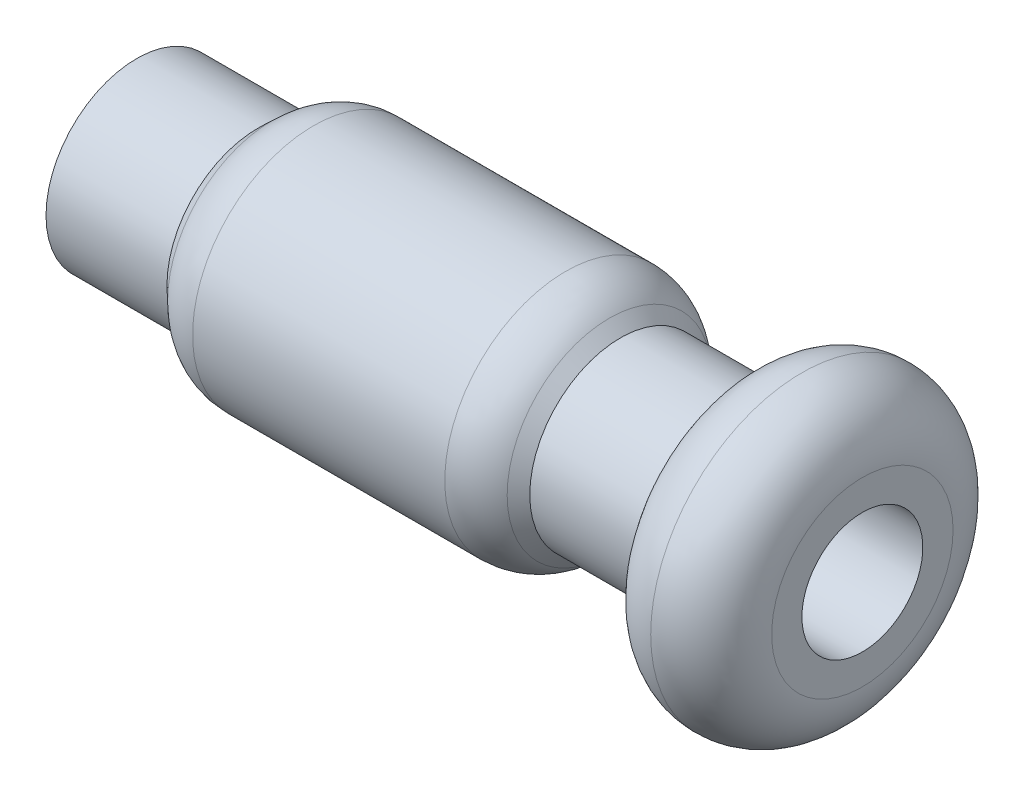
ISO-10303-21;
HEADER;
FILE_DESCRIPTION(('STEP AP214'),'2;1');
FILE_NAME('part.step','',(''),(''),'','','');
FILE_SCHEMA(('AUTOMOTIVE_DESIGN { 1 0 10303 214 1 1 1 1 }'));
ENDSEC;
DATA;
#1=APPLICATION_CONTEXT('core data for automotive mechanical design processes');
#2=APPLICATION_PROTOCOL_DEFINITION('international standard','automotive_design',2000,#1);
#3=PRODUCT_CONTEXT('',#1,'mechanical');
#4=PRODUCT('Part','Part','',(#3));
#5=PRODUCT_RELATED_PRODUCT_CATEGORY('part','',(#4));
#6=PRODUCT_DEFINITION_FORMATION('','',#4);
#7=PRODUCT_DEFINITION_CONTEXT('part definition',#1,'design');
#8=PRODUCT_DEFINITION('design','',#6,#7);
#9=PRODUCT_DEFINITION_SHAPE('','',#8);
#10=(LENGTH_UNIT() NAMED_UNIT(*) SI_UNIT(.MILLI.,.METRE.));
#11=(NAMED_UNIT(*) PLANE_ANGLE_UNIT() SI_UNIT($,.RADIAN.));
#12=(NAMED_UNIT(*) SI_UNIT($,.STERADIAN.) SOLID_ANGLE_UNIT());
#13=UNCERTAINTY_MEASURE_WITH_UNIT(LENGTH_MEASURE(1.E-05),#10,'distance_accuracy_value','');
#14=(GEOMETRIC_REPRESENTATION_CONTEXT(3) GLOBAL_UNCERTAINTY_ASSIGNED_CONTEXT((#13)) GLOBAL_UNIT_ASSIGNED_CONTEXT((#10,
#11,#12)) REPRESENTATION_CONTEXT('',''));
#15=CARTESIAN_POINT('',(0.,0.,0.));
#16=DIRECTION('',(0.,0.,1.));
#17=DIRECTION('',(1.,0.,0.));
#18=AXIS2_PLACEMENT_3D('',#15,#16,#17);
#19=CARTESIAN_POINT('',(-1.43089614650607,-1.,0.));
#20=DIRECTION('',(-1.,0.,0.));
#21=DIRECTION('',(0.,0.,1.));
#22=AXIS2_PLACEMENT_3D('',#19,#20,#21);
#23=CYLINDRICAL_SURFACE('',#22,1.5);
#24=CARTESIAN_POINT('',(0.,-1.,0.));
#25=DIRECTION('',(-1.,0.,0.));
#26=DIRECTION('',(0.,0.,1.));
#27=AXIS2_PLACEMENT_3D('',#24,#25,#26);
#28=CIRCLE('',#27,1.5);
#29=CARTESIAN_POINT('',(0.,-1.,1.5));
#30=VERTEX_POINT('',#29);
#31=EDGE_CURVE('E71',#30,#30,#28,.T.);
#32=ORIENTED_EDGE('',*,*,#31,.F.);
#33=EDGE_LOOP('',(#32));
#34=FACE_BOUND('',#33,.T.);
#35=CARTESIAN_POINT('',(2.,-1.,0.));
#36=DIRECTION('',(-1.,0.,0.));
#37=DIRECTION('',(0.,0.,1.));
#38=AXIS2_PLACEMENT_3D('',#35,#36,#37);
#39=CIRCLE('',#38,1.5);
#40=CARTESIAN_POINT('',(2.,-1.,1.5));
#41=VERTEX_POINT('',#40);
#42=EDGE_CURVE('E84',#41,#41,#39,.T.);
#43=ORIENTED_EDGE('',*,*,#42,.T.);
#44=EDGE_LOOP('',(#43));
#45=FACE_BOUND('',#44,.T.);
#46=ADVANCED_FACE('F43',(#34,#45),#23,.T.);
#47=CARTESIAN_POINT('',(0.,0.,0.));
#48=DIRECTION('',(1.,0.,0.));
#49=DIRECTION('',(0.,0.,-1.));
#50=AXIS2_PLACEMENT_3D('',#47,#48,#49);
#51=PLANE('',#50);
#52=CARTESIAN_POINT('',(0.,-1.,0.));
#53=DIRECTION('',(-1.,0.,0.));
#54=DIRECTION('',(0.,0.,1.));
#55=AXIS2_PLACEMENT_3D('',#52,#53,#54);
#56=CIRCLE('',#55,1.);
#57=CARTESIAN_POINT('',(0.,-1.,1.));
#58=VERTEX_POINT('',#57);
#59=EDGE_CURVE('E75',#58,#58,#56,.T.);
#60=ORIENTED_EDGE('',*,*,#59,.F.);
#61=EDGE_LOOP('',(#60));
#62=FACE_BOUND('',#61,.T.);
#63=ORIENTED_EDGE('',*,*,#31,.T.);
#64=EDGE_LOOP('',(#63));
#65=FACE_BOUND('',#64,.T.);
#66=ADVANCED_FACE('F115',(#62,#65),#51,.F.);
#67=CARTESIAN_POINT('',(-1.43089614650607,-1.,0.));
#68=DIRECTION('',(-1.,0.,0.));
#69=DIRECTION('',(0.,0.,1.));
#70=AXIS2_PLACEMENT_3D('',#67,#68,#69);
#71=CYLINDRICAL_SURFACE('',#70,1.);
#72=ORIENTED_EDGE('',*,*,#59,.T.);
#73=EDGE_LOOP('',(#72));
#74=FACE_BOUND('',#73,.T.);
#75=CARTESIAN_POINT('',(12.,-1.,0.));
#76=DIRECTION('',(-1.,0.,0.));
#77=DIRECTION('',(0.,0.,1.));
#78=AXIS2_PLACEMENT_3D('',#75,#76,#77);
#79=CIRCLE('',#78,1.);
#80=CARTESIAN_POINT('',(12.,-1.,1.));
#81=VERTEX_POINT('',#80);
#82=EDGE_CURVE('E85',#81,#81,#79,.T.);
#83=ORIENTED_EDGE('',*,*,#82,.F.);
#84=EDGE_LOOP('',(#83));
#85=FACE_BOUND('',#84,.T.);
#86=ADVANCED_FACE('F121',(#74,#85),#71,.F.);
#87=CARTESIAN_POINT('',(-1.43089614650607,-1.,0.));
#88=DIRECTION('',(-1.,0.,0.));
#89=DIRECTION('',(0.,0.,1.));
#90=AXIS2_PLACEMENT_3D('',#87,#88,#89);
#91=CYLINDRICAL_SURFACE('',#90,1.5);
#92=CARTESIAN_POINT('',(8.,-1.,0.));
#93=DIRECTION('',(-1.,0.,0.));
#94=DIRECTION('',(0.,0.,1.));
#95=AXIS2_PLACEMENT_3D('',#92,#93,#94);
#96=CIRCLE('',#95,1.5);
#97=CARTESIAN_POINT('',(8.,-1.,1.5));
#98=VERTEX_POINT('',#97);
#99=EDGE_CURVE('E79',#98,#98,#96,.T.);
#100=ORIENTED_EDGE('',*,*,#99,.F.);
#101=EDGE_LOOP('',(#100));
#102=FACE_BOUND('',#101,.T.);
#103=CARTESIAN_POINT('',(10.,-1.,0.));
#104=DIRECTION('',(-1.,0.,0.));
#105=DIRECTION('',(0.,0.,1.));
#106=AXIS2_PLACEMENT_3D('',#103,#104,#105);
#107=CIRCLE('',#106,1.5);
#108=CARTESIAN_POINT('',(10.,-1.,1.5));
#109=VERTEX_POINT('',#108);
#110=EDGE_CURVE('E80',#109,#109,#107,.T.);
#111=ORIENTED_EDGE('',*,*,#110,.T.);
#112=EDGE_LOOP('',(#111));
#113=FACE_BOUND('',#112,.T.);
#114=ADVANCED_FACE('F154',(#102,#113),#91,.T.);
#115=CARTESIAN_POINT('',(8.,-1.,0.));
#116=DIRECTION('',(-1.,0.,0.));
#117=DIRECTION('',(0.,0.,1.));
#118=AXIS2_PLACEMENT_3D('',#115,#116,#117);
#119=CONICAL_SURFACE('',#118,1.5,0.80775865321937);
#120=CARTESIAN_POINT('',(7.81724142500569,-1.,0.));
#121=DIRECTION('',(1.,0.,0.));
#122=DIRECTION('',(0.,0.,-1.));
#123=AXIS2_PLACEMENT_3D('',#120,#121,#122);
#124=CIRCLE('',#123,1.69112007842542);
#125=CARTESIAN_POINT('',(7.81724142500569,-1.,-1.69112007842542));
#126=VERTEX_POINT('',#125);
#127=EDGE_CURVE('E52',#126,#126,#124,.T.);
#128=ORIENTED_EDGE('',*,*,#127,.T.);
#129=EDGE_LOOP('',(#128));
#130=FACE_BOUND('',#129,.T.);
#131=ORIENTED_EDGE('',*,*,#99,.T.);
#132=EDGE_LOOP('',(#131));
#133=FACE_BOUND('',#132,.T.);
#134=ADVANCED_FACE('F148',(#130,#133),#119,.T.);
#135=CARTESIAN_POINT('',(-1.43089614650607,-1.,0.));
#136=DIRECTION('',(-1.,0.,0.));
#137=DIRECTION('',(0.,0.,1.));
#138=AXIS2_PLACEMENT_3D('',#135,#136,#137);
#139=CYLINDRICAL_SURFACE('',#138,2.);
#140=CARTESIAN_POINT('',(2.92405074644585,-1.,0.));
#141=DIRECTION('',(1.,0.,0.));
#142=DIRECTION('',(0.,0.,-1.));
#143=AXIS2_PLACEMENT_3D('',#140,#141,#142);
#144=CIRCLE('',#143,2.);
#145=CARTESIAN_POINT('',(2.92405074644585,-1.,-2.));
#146=VERTEX_POINT('',#145);
#147=EDGE_CURVE('E57',#146,#146,#144,.T.);
#148=ORIENTED_EDGE('',*,*,#147,.T.);
#149=EDGE_LOOP('',(#148));
#150=FACE_BOUND('',#149,.T.);
#151=CARTESIAN_POINT('',(7.09450147371114,-1.,0.));
#152=DIRECTION('',(1.,0.,0.));
#153=DIRECTION('',(0.,0.,-1.));
#154=AXIS2_PLACEMENT_3D('',#151,#152,#153);
#155=CIRCLE('',#154,2.);
#156=CARTESIAN_POINT('',(7.09450147371114,-1.,-2.));
#157=VERTEX_POINT('',#156);
#158=EDGE_CURVE('E63',#157,#157,#155,.F.);
#159=ORIENTED_EDGE('',*,*,#158,.T.);
#160=EDGE_LOOP('',(#159));
#161=FACE_BOUND('',#160,.T.);
#162=ADVANCED_FACE('F142',(#150,#161),#139,.T.);
#163=CARTESIAN_POINT('',(2.52287581699345,-1.,0.));
#164=DIRECTION('',(1.,0.,0.));
#165=DIRECTION('',(0.,0.,-1.));
#166=AXIS2_PLACEMENT_3D('',#163,#164,#165);
#167=CONICAL_SURFACE('',#166,2.,0.763037673575527);
#168=CARTESIAN_POINT('',(2.23293066802043,-1.,0.));
#169=DIRECTION('',(-1.,0.,0.));
#170=DIRECTION('',(0.,0.,1.));
#171=AXIS2_PLACEMENT_3D('',#168,#169,#170);
#172=CIRCLE('',#171,1.72273995129454);
#173=CARTESIAN_POINT('',(2.23293066802043,-1.,1.72273995129454));
#174=VERTEX_POINT('',#173);
#175=EDGE_CURVE('E67',#174,#174,#172,.T.);
#176=ORIENTED_EDGE('',*,*,#175,.T.);
#177=EDGE_LOOP('',(#176));
#178=FACE_BOUND('',#177,.T.);
#179=ORIENTED_EDGE('',*,*,#42,.F.);
#180=EDGE_LOOP('',(#179));
#181=FACE_BOUND('',#180,.T.);
#182=ADVANCED_FACE('F134',(#178,#181),#167,.T.);
#183=CARTESIAN_POINT('',(12.,-2.,0.));
#184=DIRECTION('',(1.,0.,0.));
#185=DIRECTION('',(0.,0.,-1.));
#186=AXIS2_PLACEMENT_3D('',#183,#184,#185);
#187=PLANE('',#186);
#188=CARTESIAN_POINT('',(12.,-1.,0.));
#189=DIRECTION('',(1.,0.,0.));
#190=DIRECTION('',(0.,0.,-1.));
#191=AXIS2_PLACEMENT_3D('',#188,#189,#190);
#192=CIRCLE('',#191,1.5);
#193=CARTESIAN_POINT('',(12.,-1.,-1.5));
#194=VERTEX_POINT('',#193);
#195=EDGE_CURVE('E10',#194,#194,#192,.T.);
#196=ORIENTED_EDGE('',*,*,#195,.T.);
#197=EDGE_LOOP('',(#196));
#198=FACE_BOUND('',#197,.T.);
#199=ORIENTED_EDGE('',*,*,#82,.T.);
#200=EDGE_LOOP('',(#199));
#201=FACE_BOUND('',#200,.T.);
#202=ADVANCED_FACE('F129',(#198,#201),#187,.T.);
#203=CARTESIAN_POINT('',(2.92405074644585,-1.,0.));
#204=DIRECTION('',(1.,0.,0.));
#205=DIRECTION('',(0.,0.,-1.));
#206=AXIS2_PLACEMENT_3D('',#203,#204,#205);
#207=DEGENERATE_TOROIDAL_SURFACE('',#206,1.,1.,.T.);
#208=ORIENTED_EDGE('',*,*,#147,.F.);
#209=EDGE_LOOP('',(#208));
#210=FACE_BOUND('',#209,.T.);
#211=ORIENTED_EDGE('',*,*,#175,.F.);
#212=EDGE_LOOP('',(#211));
#213=FACE_BOUND('',#212,.T.);
#214=ADVANCED_FACE('F110',(#210,#213),#207,.T.);
#215=CARTESIAN_POINT('',(7.09450147371114,-1.,0.));
#216=DIRECTION('',(1.,0.,0.));
#217=DIRECTION('',(0.,0.,-1.));
#218=AXIS2_PLACEMENT_3D('',#215,#216,#217);
#219=DEGENERATE_TOROIDAL_SURFACE('',#218,1.,1.,.T.);
#220=ORIENTED_EDGE('',*,*,#127,.F.);
#221=EDGE_LOOP('',(#220));
#222=FACE_BOUND('',#221,.T.);
#223=ORIENTED_EDGE('',*,*,#158,.F.);
#224=EDGE_LOOP('',(#223));
#225=FACE_BOUND('',#224,.T.);
#226=ADVANCED_FACE('F103',(#222,#225),#219,.T.);
#227=CARTESIAN_POINT('',(11.,-1.,0.));
#228=DIRECTION('',(-1.,0.,0.));
#229=DIRECTION('',(0.,0.,1.));
#230=AXIS2_PLACEMENT_3D('',#227,#228,#229);
#231=TOROIDAL_SURFACE('',#230,1.5,1.);
#232=ORIENTED_EDGE('',*,*,#110,.F.);
#233=EDGE_LOOP('',(#232));
#234=FACE_BOUND('',#233,.T.);
#235=CARTESIAN_POINT('',(11.,-1.,0.));
#236=DIRECTION('',(-1.,0.,0.));
#237=DIRECTION('',(0.,0.,1.));
#238=AXIS2_PLACEMENT_3D('',#235,#236,#237);
#239=CIRCLE('',#238,2.5);
#240=CARTESIAN_POINT('',(11.,-1.,2.5));
#241=VERTEX_POINT('',#240);
#242=EDGE_CURVE('E47',#241,#241,#239,.F.);
#243=ORIENTED_EDGE('',*,*,#242,.F.);
#244=EDGE_LOOP('',(#243));
#245=FACE_BOUND('',#244,.T.);
#246=ADVANCED_FACE('F45',(#234,#245),#231,.T.);
#247=CARTESIAN_POINT('',(11.,-1.,0.));
#248=DIRECTION('',(1.,0.,0.));
#249=DIRECTION('',(0.,0.,-1.));
#250=AXIS2_PLACEMENT_3D('',#247,#248,#249);
#251=TOROIDAL_SURFACE('',#250,1.5,1.);
#252=ORIENTED_EDGE('',*,*,#195,.F.);
#253=EDGE_LOOP('',(#252));
#254=FACE_BOUND('',#253,.T.);
#255=ORIENTED_EDGE('',*,*,#242,.T.);
#256=EDGE_LOOP('',(#255));
#257=FACE_BOUND('',#256,.T.);
#258=ADVANCED_FACE('F100',(#254,#257),#251,.T.);
#259=CLOSED_SHELL('',(#46,#66,#86,#114,#134,#162,#182,#202,#214,#226,#246,#258));
#260=MANIFOLD_SOLID_BREP('B2',#259);
#261=ADVANCED_BREP_SHAPE_REPRESENTATION('',(#18,#260),#14);
#262=SHAPE_DEFINITION_REPRESENTATION(#9,#261);
ENDSEC;
END-ISO-10303-21;
